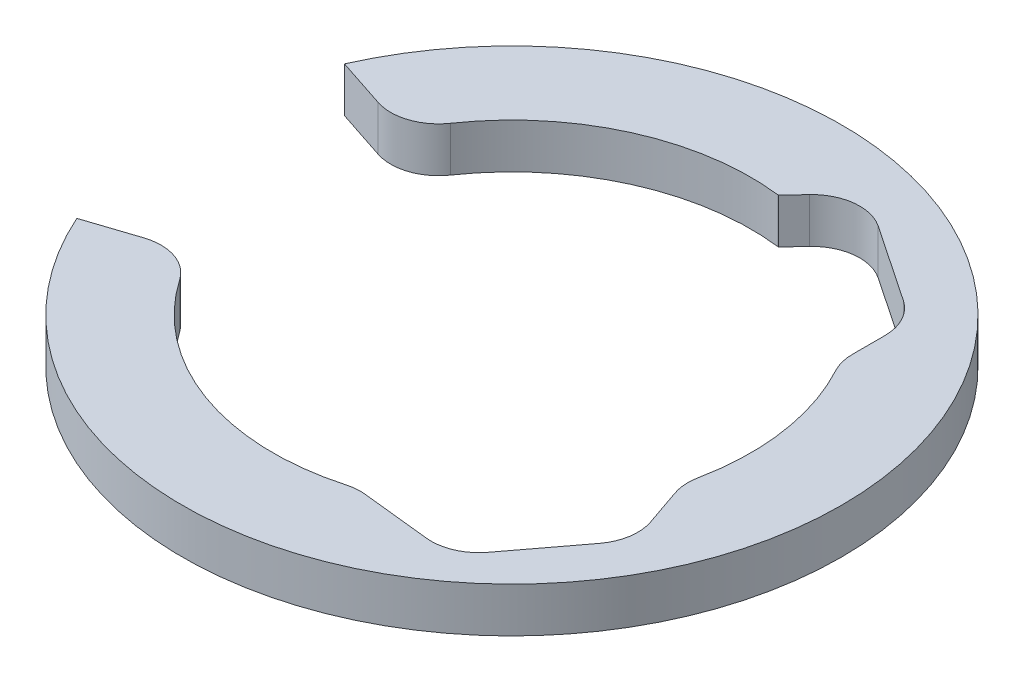
ISO-10303-21;
HEADER;
FILE_DESCRIPTION(('STEP AP214'),'2;1');
FILE_NAME('part.step','',(''),(''),'','','');
FILE_SCHEMA(('AUTOMOTIVE_DESIGN { 1 0 10303 214 1 1 1 1 }'));
ENDSEC;
DATA;
#1=APPLICATION_CONTEXT('core data for automotive mechanical design processes');
#2=APPLICATION_PROTOCOL_DEFINITION('international standard','automotive_design',2000,#1);
#3=PRODUCT_CONTEXT('',#1,'mechanical');
#4=PRODUCT('Part','Part','',(#3));
#5=PRODUCT_RELATED_PRODUCT_CATEGORY('part','',(#4));
#6=PRODUCT_DEFINITION_FORMATION('','',#4);
#7=PRODUCT_DEFINITION_CONTEXT('part definition',#1,'design');
#8=PRODUCT_DEFINITION('design','',#6,#7);
#9=PRODUCT_DEFINITION_SHAPE('','',#8);
#10=(LENGTH_UNIT() NAMED_UNIT(*) SI_UNIT(.MILLI.,.METRE.));
#11=(NAMED_UNIT(*) PLANE_ANGLE_UNIT() SI_UNIT($,.RADIAN.));
#12=(NAMED_UNIT(*) SI_UNIT($,.STERADIAN.) SOLID_ANGLE_UNIT());
#13=UNCERTAINTY_MEASURE_WITH_UNIT(LENGTH_MEASURE(1.E-05),#10,'distance_accuracy_value','');
#14=(GEOMETRIC_REPRESENTATION_CONTEXT(3) GLOBAL_UNCERTAINTY_ASSIGNED_CONTEXT((#13)) GLOBAL_UNIT_ASSIGNED_CONTEXT((#10,
#11,#12)) REPRESENTATION_CONTEXT('',''));
#15=CARTESIAN_POINT('',(0.,0.,0.));
#16=DIRECTION('',(0.,0.,1.));
#17=DIRECTION('',(1.,0.,0.));
#18=AXIS2_PLACEMENT_3D('',#15,#16,#17);
#19=CARTESIAN_POINT('',(-4.94086592085773,0.94,-3.40409223613384));
#20=DIRECTION('',(0.,-1.,0.));
#21=DIRECTION('',(0.,0.,-1.));
#22=AXIS2_PLACEMENT_3D('',#19,#20,#21);
#23=CYLINDRICAL_SURFACE('',#22,1.);
#24=CARTESIAN_POINT('',(-4.94086592085773,0.,-3.40409223613384));
#25=DIRECTION('',(0.,1.,0.));
#26=DIRECTION('',(0.,0.,1.));
#27=AXIS2_PLACEMENT_3D('',#24,#25,#26);
#28=CIRCLE('',#27,1.);
#29=CARTESIAN_POINT('',(-4.11738826738144,0.,-2.83674353011153));
#30=VERTEX_POINT('',#29);
#31=CARTESIAN_POINT('',(-5.2538636790078,0.,-2.45433837149678));
#32=VERTEX_POINT('',#31);
#33=EDGE_CURVE('E214',#30,#32,#28,.F.);
#34=ORIENTED_EDGE('',*,*,#33,.F.);
#35=DIRECTION('',(0.,-1.,0.));
#36=VECTOR('',#35,1.);
#37=CARTESIAN_POINT('',(-4.11738826738144,0.94,-2.83674353011153));
#38=LINE('',#37,#36);
#39=CARTESIAN_POINT('',(-4.11738826738144,0.94,-2.83674353011153));
#40=VERTEX_POINT('',#39);
#41=EDGE_CURVE('E11',#40,#30,#38,.T.);
#42=ORIENTED_EDGE('',*,*,#41,.F.);
#43=CARTESIAN_POINT('',(-4.94086592085773,0.94,-3.40409223613384));
#44=DIRECTION('',(0.,1.,0.));
#45=DIRECTION('',(0.,0.,1.));
#46=AXIS2_PLACEMENT_3D('',#43,#44,#45);
#47=CIRCLE('',#46,1.);
#48=CARTESIAN_POINT('',(-5.2538636790078,0.94,-2.45433837149678));
#49=VERTEX_POINT('',#48);
#50=EDGE_CURVE('E270',#40,#49,#47,.F.);
#51=ORIENTED_EDGE('',*,*,#50,.T.);
#52=DIRECTION('',(0.,-1.,0.));
#53=VECTOR('',#52,1.);
#54=CARTESIAN_POINT('',(-5.2538636790078,0.94,-2.45433837149678));
#55=LINE('',#54,#53);
#56=EDGE_CURVE('E51',#49,#32,#55,.T.);
#57=ORIENTED_EDGE('',*,*,#56,.T.);
#58=EDGE_LOOP('',(#34,#42,#51,#57));
#59=FACE_BOUND('',#58,.T.);
#60=ADVANCED_FACE('F35',(#59),#23,.T.);
#61=CARTESIAN_POINT('',(0.,0.94,0.));
#62=DIRECTION('',(0.,-1.,0.));
#63=DIRECTION('',(0.,0.,-1.));
#64=AXIS2_PLACEMENT_3D('',#61,#62,#63);
#65=CYLINDRICAL_SURFACE('',#64,5.);
#66=CARTESIAN_POINT('',(0.,0.,0.));
#67=DIRECTION('',(0.,1.,0.));
#68=DIRECTION('',(0.,0.,1.));
#69=AXIS2_PLACEMENT_3D('',#66,#67,#68);
#70=CIRCLE('',#69,5.);
#71=CARTESIAN_POINT('',(0.606687951738068,0.,-4.96305649063315));
#72=VERTEX_POINT('',#71);
#73=EDGE_CURVE('E216',#72,#30,#70,.T.);
#74=ORIENTED_EDGE('',*,*,#73,.F.);
#75=DIRECTION('',(0.,-1.,0.));
#76=VECTOR('',#75,1.);
#77=CARTESIAN_POINT('',(0.606687951738068,0.94,-4.96305649063315));
#78=LINE('',#77,#76);
#79=CARTESIAN_POINT('',(0.606687951738068,0.94,-4.96305649063315));
#80=VERTEX_POINT('',#79);
#81=EDGE_CURVE('E43',#80,#72,#78,.T.);
#82=ORIENTED_EDGE('',*,*,#81,.F.);
#83=CARTESIAN_POINT('',(0.,0.94,0.));
#84=DIRECTION('',(0.,1.,0.));
#85=DIRECTION('',(0.,0.,1.));
#86=AXIS2_PLACEMENT_3D('',#83,#84,#85);
#87=CIRCLE('',#86,5.);
#88=EDGE_CURVE('E325',#80,#40,#87,.T.);
#89=ORIENTED_EDGE('',*,*,#88,.T.);
#90=ORIENTED_EDGE('',*,*,#41,.T.);
#91=EDGE_LOOP('',(#74,#82,#89,#90));
#92=FACE_BOUND('',#91,.T.);
#93=ADVANCED_FACE('F324',(#92),#65,.F.);
#94=CARTESIAN_POINT('',(0.611804478104493,0.94,-4.96242568748557));
#95=DIRECTION('',(0.122360960660061,0.,-0.992485665038215));
#96=DIRECTION('',(-0.992485665038215,0.,-0.122360960660061));
#97=AXIS2_PLACEMENT_3D('',#94,#95,#96);
#98=PLANE('',#97);
#99=DIRECTION('',(0.992485665038215,0.,0.122360960660061));
#100=VECTOR('',#99,1.);
#101=CARTESIAN_POINT('',(0.611804478104493,0.,-4.96242568748557));
#102=LINE('',#101,#100);
#103=CARTESIAN_POINT('',(0.616921004471256,0.,-4.96179488433794));
#104=VERTEX_POINT('',#103);
#105=EDGE_CURVE('E219',#72,#104,#102,.T.);
#106=ORIENTED_EDGE('',*,*,#105,.T.);
#107=DIRECTION('',(0.,-1.,0.));
#108=VECTOR('',#107,1.);
#109=CARTESIAN_POINT('',(0.616921004471256,0.94,-4.96179488433794));
#110=LINE('',#109,#108);
#111=CARTESIAN_POINT('',(0.616921004471256,0.94,-4.96179488433794));
#112=VERTEX_POINT('',#111);
#113=EDGE_CURVE('E309',#112,#104,#110,.T.);
#114=ORIENTED_EDGE('',*,*,#113,.F.);
#115=DIRECTION('',(0.992485665038215,0.,0.122360960660061));
#116=VECTOR('',#115,1.);
#117=CARTESIAN_POINT('',(0.611804478104493,0.94,-4.96242568748557));
#118=LINE('',#117,#116);
#119=EDGE_CURVE('E316',#80,#112,#118,.T.);
#120=ORIENTED_EDGE('',*,*,#119,.F.);
#121=ORIENTED_EDGE('',*,*,#81,.T.);
#122=EDGE_LOOP('',(#106,#114,#120,#121));
#123=FACE_BOUND('',#122,.T.);
#124=ADVANCED_FACE('F314',(#123),#98,.F.);
#125=CARTESIAN_POINT('',(-2.14641419663019,0.94,-2.0080441743697));
#126=DIRECTION('',(-0.730253029028529,0.,-0.683176780631967));
#127=DIRECTION('',(-0.683176780631967,0.,0.730253029028529));
#128=AXIS2_PLACEMENT_3D('',#125,#126,#127);
#129=PLANE('',#128);
#130=DIRECTION('',(0.683176780631967,0.,-0.730253029028529));
#131=VECTOR('',#130,1.);
#132=CARTESIAN_POINT('',(-2.14641419663019,0.,-2.0080441743697));
#133=LINE('',#132,#131);
#134=CARTESIAN_POINT('',(0.93326336513957,0.,-5.29993571938561));
#135=VERTEX_POINT('',#134);
#136=EDGE_CURVE('E221',#104,#135,#133,.T.);
#137=ORIENTED_EDGE('',*,*,#136,.T.);
#138=DIRECTION('',(0.,-1.,0.));
#139=VECTOR('',#138,1.);
#140=CARTESIAN_POINT('',(0.93326336513957,0.94,-5.29993571938561));
#141=LINE('',#140,#139);
#142=CARTESIAN_POINT('',(0.93326336513957,0.94,-5.29993571938561));
#143=VERTEX_POINT('',#142);
#144=EDGE_CURVE('E307',#143,#135,#141,.T.);
#145=ORIENTED_EDGE('',*,*,#144,.F.);
#146=DIRECTION('',(0.683176780631967,0.,-0.730253029028529));
#147=VECTOR('',#146,1.);
#148=CARTESIAN_POINT('',(-2.14641419663019,0.94,-2.0080441743697));
#149=LINE('',#148,#147);
#150=EDGE_CURVE('E605',#112,#143,#149,.T.);
#151=ORIENTED_EDGE('',*,*,#150,.F.);
#152=ORIENTED_EDGE('',*,*,#113,.T.);
#153=EDGE_LOOP('',(#137,#145,#151,#152));
#154=FACE_BOUND('',#153,.T.);
#155=ADVANCED_FACE('F343',(#154),#129,.F.);
#156=CARTESIAN_POINT('',(1.6635163941681,0.94,-4.61675893875365));
#157=DIRECTION('',(0.,-1.,0.));
#158=DIRECTION('',(0.,0.,-1.));
#159=AXIS2_PLACEMENT_3D('',#156,#157,#158);
#160=CYLINDRICAL_SURFACE('',#159,1.);
#161=CARTESIAN_POINT('',(1.6635163941681,0.,-4.61675893875365));
#162=DIRECTION('',(0.,1.,0.));
#163=DIRECTION('',(0.,0.,1.));
#164=AXIS2_PLACEMENT_3D('',#161,#162,#163);
#165=CIRCLE('',#164,1.);
#166=CARTESIAN_POINT('',(2.22211677364717,0.,-5.44619586585892));
#167=VERTEX_POINT('',#166);
#168=EDGE_CURVE('E224',#167,#135,#165,.T.);
#169=ORIENTED_EDGE('',*,*,#168,.F.);
#170=DIRECTION('',(0.,-1.,0.));
#171=VECTOR('',#170,1.);
#172=CARTESIAN_POINT('',(2.22211677364717,0.94,-5.44619586585892));
#173=LINE('',#172,#171);
#174=CARTESIAN_POINT('',(2.22211677364717,0.94,-5.44619586585892));
#175=VERTEX_POINT('',#174);
#176=EDGE_CURVE('E305',#175,#167,#173,.T.);
#177=ORIENTED_EDGE('',*,*,#176,.F.);
#178=CARTESIAN_POINT('',(1.6635163941681,0.94,-4.61675893875365));
#179=DIRECTION('',(0.,1.,0.));
#180=DIRECTION('',(0.,0.,1.));
#181=AXIS2_PLACEMENT_3D('',#178,#179,#180);
#182=CIRCLE('',#181,1.);
#183=EDGE_CURVE('E602',#175,#143,#182,.T.);
#184=ORIENTED_EDGE('',*,*,#183,.T.);
#185=ORIENTED_EDGE('',*,*,#144,.T.);
#186=EDGE_LOOP('',(#169,#177,#184,#185));
#187=FACE_BOUND('',#186,.T.);
#188=ADVANCED_FACE('F348',(#187),#160,.F.);
#189=CARTESIAN_POINT('',(3.21672890590133,0.94,-4.77635504209592));
#190=DIRECTION('',(0.558600379479064,0.,-0.829436927105277));
#191=DIRECTION('',(-0.829436927105277,0.,-0.558600379479064));
#192=AXIS2_PLACEMENT_3D('',#189,#190,#191);
#193=PLANE('',#192);
#194=DIRECTION('',(0.829436927105277,0.,0.558600379479064));
#195=VECTOR('',#194,1.);
#196=CARTESIAN_POINT('',(3.21672890590133,0.,-4.77635504209592));
#197=LINE('',#196,#195);
#198=CARTESIAN_POINT('',(3.83533968853841,0.,-4.35973961705462));
#199=VERTEX_POINT('',#198);
#200=EDGE_CURVE('E227',#167,#199,#197,.T.);
#201=ORIENTED_EDGE('',*,*,#200,.T.);
#202=DIRECTION('',(0.,-1.,0.));
#203=VECTOR('',#202,1.);
#204=CARTESIAN_POINT('',(3.83533968853841,0.94,-4.35973961705462));
#205=LINE('',#204,#203);
#206=CARTESIAN_POINT('',(3.83533968853841,0.94,-4.35973961705462));
#207=VERTEX_POINT('',#206);
#208=EDGE_CURVE('E302',#207,#199,#205,.T.);
#209=ORIENTED_EDGE('',*,*,#208,.F.);
#210=DIRECTION('',(0.829436927105277,0.,0.558600379479064));
#211=VECTOR('',#210,1.);
#212=CARTESIAN_POINT('',(3.21672890590133,0.94,-4.77635504209592));
#213=LINE('',#212,#211);
#214=EDGE_CURVE('E599',#175,#207,#213,.T.);
#215=ORIENTED_EDGE('',*,*,#214,.F.);
#216=ORIENTED_EDGE('',*,*,#176,.T.);
#217=EDGE_LOOP('',(#201,#209,#215,#216));
#218=FACE_BOUND('',#217,.T.);
#219=ADVANCED_FACE('F352',(#218),#193,.F.);
#220=CARTESIAN_POINT('',(3.27673930905935,0.94,-3.53030268994934));
#221=DIRECTION('',(0.,-1.,0.));
#222=DIRECTION('',(0.,0.,-1.));
#223=AXIS2_PLACEMENT_3D('',#220,#221,#222);
#224=CYLINDRICAL_SURFACE('',#223,1.);
#225=CARTESIAN_POINT('',(3.27673930905935,0.,-3.53030268994934));
#226=DIRECTION('',(0.,1.,0.));
#227=DIRECTION('',(0.,0.,1.));
#228=AXIS2_PLACEMENT_3D('',#225,#226,#227);
#229=CIRCLE('',#228,1.);
#230=CARTESIAN_POINT('',(4.27673930905935,0.,-3.53030268994934));
#231=VERTEX_POINT('',#230);
#232=EDGE_CURVE('E229',#199,#231,#229,.F.);
#233=ORIENTED_EDGE('',*,*,#232,.T.);
#234=DIRECTION('',(0.,-1.,0.));
#235=VECTOR('',#234,1.);
#236=CARTESIAN_POINT('',(4.27673930905935,0.94,-3.53030268994934));
#237=LINE('',#236,#235);
#238=CARTESIAN_POINT('',(4.27673930905935,0.94,-3.53030268994934));
#239=VERTEX_POINT('',#238);
#240=EDGE_CURVE('E299',#239,#231,#237,.T.);
#241=ORIENTED_EDGE('',*,*,#240,.F.);
#242=CARTESIAN_POINT('',(3.27673930905935,0.94,-3.53030268994934));
#243=DIRECTION('',(0.,1.,0.));
#244=DIRECTION('',(0.,0.,1.));
#245=AXIS2_PLACEMENT_3D('',#242,#243,#244);
#246=CIRCLE('',#245,1.);
#247=EDGE_CURVE('E597',#207,#239,#246,.F.);
#248=ORIENTED_EDGE('',*,*,#247,.F.);
#249=ORIENTED_EDGE('',*,*,#208,.T.);
#250=EDGE_LOOP('',(#233,#241,#248,#249));
#251=FACE_BOUND('',#250,.T.);
#252=ADVANCED_FACE('F356',(#251),#224,.F.);
#253=CARTESIAN_POINT('',(4.27673930905935,0.94,0.));
#254=DIRECTION('',(1.,0.,0.));
#255=DIRECTION('',(0.,0.,-1.));
#256=AXIS2_PLACEMENT_3D('',#253,#254,#255);
#257=PLANE('',#256);
#258=DIRECTION('',(0.,0.,1.));
#259=VECTOR('',#258,1.);
#260=CARTESIAN_POINT('',(4.27673930905935,0.,0.));
#261=LINE('',#260,#259);
#262=CARTESIAN_POINT('',(4.27673930905935,0.,-2.85587504352482));
#263=VERTEX_POINT('',#262);
#264=EDGE_CURVE('E231',#231,#263,#261,.T.);
#265=ORIENTED_EDGE('',*,*,#264,.T.);
#266=DIRECTION('',(0.,-1.,0.));
#267=VECTOR('',#266,1.);
#268=CARTESIAN_POINT('',(4.27673930905935,0.94,-2.85587504352482));
#269=LINE('',#268,#267);
#270=CARTESIAN_POINT('',(4.27673930905935,0.94,-2.85587504352482));
#271=VERTEX_POINT('',#270);
#272=EDGE_CURVE('E297',#271,#263,#269,.T.);
#273=ORIENTED_EDGE('',*,*,#272,.F.);
#274=DIRECTION('',(0.,0.,1.));
#275=VECTOR('',#274,1.);
#276=CARTESIAN_POINT('',(4.27673930905935,0.94,0.));
#277=LINE('',#276,#275);
#278=EDGE_CURVE('E613',#239,#271,#277,.T.);
#279=ORIENTED_EDGE('',*,*,#278,.F.);
#280=ORIENTED_EDGE('',*,*,#240,.T.);
#281=EDGE_LOOP('',(#265,#273,#279,#280));
#282=FACE_BOUND('',#281,.T.);
#283=ADVANCED_FACE('F360',(#282),#257,.F.);
#284=CARTESIAN_POINT('',(5.27673930905935,0.94,-2.85587504352482));
#285=DIRECTION('',(0.,-1.,0.));
#286=DIRECTION('',(0.,0.,-1.));
#287=AXIS2_PLACEMENT_3D('',#284,#285,#286);
#288=CYLINDRICAL_SURFACE('',#287,1.);
#289=CARTESIAN_POINT('',(5.27673930905935,0.,-2.85587504352482));
#290=DIRECTION('',(0.,1.,0.));
#291=DIRECTION('',(0.,0.,1.));
#292=AXIS2_PLACEMENT_3D('',#289,#290,#291);
#293=CIRCLE('',#292,1.);
#294=CARTESIAN_POINT('',(4.39728275754945,0.,-2.37989586960402));
#295=VERTEX_POINT('',#294);
#296=EDGE_CURVE('E234',#295,#263,#293,.F.);
#297=ORIENTED_EDGE('',*,*,#296,.F.);
#298=DIRECTION('',(0.,-1.,0.));
#299=VECTOR('',#298,1.);
#300=CARTESIAN_POINT('',(4.39728275754945,0.94,-2.37989586960402));
#301=LINE('',#300,#299);
#302=CARTESIAN_POINT('',(4.39728275754945,0.94,-2.37989586960402));
#303=VERTEX_POINT('',#302);
#304=EDGE_CURVE('E295',#303,#295,#301,.T.);
#305=ORIENTED_EDGE('',*,*,#304,.F.);
#306=CARTESIAN_POINT('',(5.27673930905935,0.94,-2.85587504352482));
#307=DIRECTION('',(0.,1.,0.));
#308=DIRECTION('',(0.,0.,1.));
#309=AXIS2_PLACEMENT_3D('',#306,#307,#308);
#310=CIRCLE('',#309,1.);
#311=EDGE_CURVE('E589',#303,#271,#310,.F.);
#312=ORIENTED_EDGE('',*,*,#311,.T.);
#313=ORIENTED_EDGE('',*,*,#272,.T.);
#314=EDGE_LOOP('',(#297,#305,#312,#313));
#315=FACE_BOUND('',#314,.T.);
#316=ADVANCED_FACE('F364',(#315),#288,.T.);
#317=CARTESIAN_POINT('',(0.,0.94,0.));
#318=DIRECTION('',(0.,-1.,0.));
#319=DIRECTION('',(0.,0.,-1.));
#320=AXIS2_PLACEMENT_3D('',#317,#318,#319);
#321=CYLINDRICAL_SURFACE('',#320,5.);
#322=CARTESIAN_POINT('',(0.,0.,0.));
#323=DIRECTION('',(0.,1.,0.));
#324=DIRECTION('',(0.,0.,1.));
#325=AXIS2_PLACEMENT_3D('',#322,#323,#324);
#326=CIRCLE('',#325,5.);
#327=CARTESIAN_POINT('',(4.90006825482678,0.,0.994651244426331));
#328=VERTEX_POINT('',#327);
#329=EDGE_CURVE('E237',#328,#295,#326,.T.);
#330=ORIENTED_EDGE('',*,*,#329,.F.);
#331=DIRECTION('',(0.,-1.,0.));
#332=VECTOR('',#331,1.);
#333=CARTESIAN_POINT('',(4.90006825482678,0.94,0.994651244426331));
#334=LINE('',#333,#332);
#335=CARTESIAN_POINT('',(4.90006825482678,0.94,0.994651244426331));
#336=VERTEX_POINT('',#335);
#337=EDGE_CURVE('E293',#336,#328,#334,.T.);
#338=ORIENTED_EDGE('',*,*,#337,.F.);
#339=CARTESIAN_POINT('',(0.,0.94,0.));
#340=DIRECTION('',(0.,1.,0.));
#341=DIRECTION('',(0.,0.,1.));
#342=AXIS2_PLACEMENT_3D('',#339,#340,#341);
#343=CIRCLE('',#342,5.);
#344=EDGE_CURVE('E585',#336,#303,#343,.T.);
#345=ORIENTED_EDGE('',*,*,#344,.T.);
#346=ORIENTED_EDGE('',*,*,#304,.T.);
#347=EDGE_LOOP('',(#330,#338,#345,#346));
#348=FACE_BOUND('',#347,.T.);
#349=ADVANCED_FACE('F368',(#348),#321,.F.);
#350=CARTESIAN_POINT('',(5.88008190579213,0.94,1.1935814933116));
#351=DIRECTION('',(0.,-1.,0.));
#352=DIRECTION('',(0.,0.,-1.));
#353=AXIS2_PLACEMENT_3D('',#350,#351,#352);
#354=CYLINDRICAL_SURFACE('',#353,0.999999999999999);
#355=CARTESIAN_POINT('',(5.88008190579213,0.,1.1935814933116));
#356=DIRECTION('',(0.,1.,0.));
#357=DIRECTION('',(0.,0.,1.));
#358=AXIS2_PLACEMENT_3D('',#355,#356,#357);
#359=CIRCLE('',#358,0.999999999999999);
#360=CARTESIAN_POINT('',(4.93449413525411,0.,1.51894862165885));
#361=VERTEX_POINT('',#360);
#362=EDGE_CURVE('E240',#361,#328,#359,.F.);
#363=ORIENTED_EDGE('',*,*,#362,.F.);
#364=DIRECTION('',(0.,-1.,0.));
#365=VECTOR('',#364,1.);
#366=CARTESIAN_POINT('',(4.93449413525411,0.94,1.51894862165885));
#367=LINE('',#366,#365);
#368=CARTESIAN_POINT('',(4.93449413525411,0.94,1.51894862165885));
#369=VERTEX_POINT('',#368);
#370=EDGE_CURVE('E291',#369,#361,#367,.T.);
#371=ORIENTED_EDGE('',*,*,#370,.F.);
#372=CARTESIAN_POINT('',(5.88008190579213,0.94,1.1935814933116));
#373=DIRECTION('',(0.,1.,0.));
#374=DIRECTION('',(0.,0.,1.));
#375=AXIS2_PLACEMENT_3D('',#372,#373,#374);
#376=CIRCLE('',#375,0.999999999999999);
#377=EDGE_CURVE('E579',#369,#336,#376,.F.);
#378=ORIENTED_EDGE('',*,*,#377,.T.);
#379=ORIENTED_EDGE('',*,*,#337,.T.);
#380=EDGE_LOOP('',(#363,#371,#378,#379));
#381=FACE_BOUND('',#380,.T.);
#382=ADVANCED_FACE('F372',(#381),#354,.T.);
#383=CARTESIAN_POINT('',(3.94478543249207,0.94,-1.35736052020397));
#384=DIRECTION('',(0.945587770538021,0.,-0.325367128347248));
#385=DIRECTION('',(-0.325367128347248,0.,-0.945587770538021));
#386=AXIS2_PLACEMENT_3D('',#383,#384,#385);
#387=PLANE('',#386);
#388=DIRECTION('',(0.325367128347248,0.,0.945587770538021));
#389=VECTOR('',#388,1.);
#390=CARTESIAN_POINT('',(3.94478543249207,0.,-1.35736052020397));
#391=LINE('',#390,#389);
#392=CARTESIAN_POINT('',(5.20236441680341,0.,2.29743802718128));
#393=VERTEX_POINT('',#392);
#394=EDGE_CURVE('E243',#361,#393,#391,.T.);
#395=ORIENTED_EDGE('',*,*,#394,.T.);
#396=DIRECTION('',(0.,-1.,0.));
#397=VECTOR('',#396,1.);
#398=CARTESIAN_POINT('',(5.20236441680341,0.94,2.29743802718128));
#399=LINE('',#398,#397);
#400=CARTESIAN_POINT('',(5.20236441680341,0.94,2.29743802718128));
#401=VERTEX_POINT('',#400);
#402=EDGE_CURVE('E288',#401,#393,#399,.T.);
#403=ORIENTED_EDGE('',*,*,#402,.F.);
#404=DIRECTION('',(0.325367128347248,0.,0.945587770538021));
#405=VECTOR('',#404,1.);
#406=CARTESIAN_POINT('',(3.94478543249207,0.94,-1.35736052020397));
#407=LINE('',#406,#405);
#408=EDGE_CURVE('E576',#369,#401,#407,.T.);
#409=ORIENTED_EDGE('',*,*,#408,.F.);
#410=ORIENTED_EDGE('',*,*,#370,.T.);
#411=EDGE_LOOP('',(#395,#403,#409,#410));
#412=FACE_BOUND('',#411,.T.);
#413=ADVANCED_FACE('F376',(#412),#387,.F.);
#414=CARTESIAN_POINT('',(4.25677664626539,0.94,2.62280515552853));
#415=DIRECTION('',(0.,-1.,0.));
#416=DIRECTION('',(0.,0.,-1.));
#417=AXIS2_PLACEMENT_3D('',#414,#415,#416);
#418=CYLINDRICAL_SURFACE('',#417,1.);
#419=CARTESIAN_POINT('',(4.25677664626539,0.,2.62280515552853));
#420=DIRECTION('',(0.,1.,0.));
#421=DIRECTION('',(0.,0.,1.));
#422=AXIS2_PLACEMENT_3D('',#419,#420,#421);
#423=CIRCLE('',#422,1.);
#424=CARTESIAN_POINT('',(5.05446685520372,0.,3.22587259003641));
#425=VERTEX_POINT('',#424);
#426=EDGE_CURVE('E245',#393,#425,#423,.F.);
#427=ORIENTED_EDGE('',*,*,#426,.T.);
#428=DIRECTION('',(0.,-1.,0.));
#429=VECTOR('',#428,1.);
#430=CARTESIAN_POINT('',(5.05446685520372,0.94,3.22587259003641));
#431=LINE('',#430,#429);
#432=CARTESIAN_POINT('',(5.05446685520372,0.94,3.22587259003641));
#433=VERTEX_POINT('',#432);
#434=EDGE_CURVE('E285',#433,#425,#431,.T.);
#435=ORIENTED_EDGE('',*,*,#434,.F.);
#436=CARTESIAN_POINT('',(4.25677664626539,0.94,2.62280515552853));
#437=DIRECTION('',(0.,1.,0.));
#438=DIRECTION('',(0.,0.,1.));
#439=AXIS2_PLACEMENT_3D('',#436,#437,#438);
#440=CIRCLE('',#439,1.);
#441=EDGE_CURVE('E574',#401,#433,#440,.F.);
#442=ORIENTED_EDGE('',*,*,#441,.F.);
#443=ORIENTED_EDGE('',*,*,#402,.T.);
#444=EDGE_LOOP('',(#427,#435,#442,#443));
#445=FACE_BOUND('',#444,.T.);
#446=ADVANCED_FACE('F380',(#445),#418,.F.);
#447=CARTESIAN_POINT('',(4.76804758860792,0.94,3.60472548697854));
#448=DIRECTION('',(0.797690208938336,0.,0.603067434507878));
#449=DIRECTION('',(0.603067434507878,0.,-0.797690208938336));
#450=AXIS2_PLACEMENT_3D('',#447,#448,#449);
#451=PLANE('',#450);
#452=DIRECTION('',(-0.603067434507878,0.,0.797690208938336));
#453=VECTOR('',#452,1.);
#454=CARTESIAN_POINT('',(4.76804758860792,0.,3.60472548697854));
#455=LINE('',#454,#453);
#456=CARTESIAN_POINT('',(4.05451714677794,0.,4.54852748101539));
#457=VERTEX_POINT('',#456);
#458=EDGE_CURVE('E247',#425,#457,#455,.T.);
#459=ORIENTED_EDGE('',*,*,#458,.T.);
#460=DIRECTION('',(0.,-1.,0.));
#461=VECTOR('',#460,1.);
#462=CARTESIAN_POINT('',(4.05451714677794,0.94,4.54852748101539));
#463=LINE('',#462,#461);
#464=CARTESIAN_POINT('',(4.05451714677794,0.94,4.54852748101539));
#465=VERTEX_POINT('',#464);
#466=EDGE_CURVE('E283',#465,#457,#463,.T.);
#467=ORIENTED_EDGE('',*,*,#466,.F.);
#468=DIRECTION('',(-0.603067434507878,0.,0.797690208938336));
#469=VECTOR('',#468,1.);
#470=CARTESIAN_POINT('',(4.76804758860792,0.94,3.60472548697854));
#471=LINE('',#470,#469);
#472=EDGE_CURVE('E620',#433,#465,#471,.T.);
#473=ORIENTED_EDGE('',*,*,#472,.F.);
#474=ORIENTED_EDGE('',*,*,#434,.T.);
#475=EDGE_LOOP('',(#459,#467,#473,#474));
#476=FACE_BOUND('',#475,.T.);
#477=ADVANCED_FACE('F384',(#476),#451,.F.);
#478=CARTESIAN_POINT('',(3.2568269378396,0.94,3.94546004650751));
#479=DIRECTION('',(0.,-1.,0.));
#480=DIRECTION('',(0.,0.,-1.));
#481=AXIS2_PLACEMENT_3D('',#478,#479,#480);
#482=CYLINDRICAL_SURFACE('',#481,1.);
#483=CARTESIAN_POINT('',(3.2568269378396,0.,3.94546004650751));
#484=DIRECTION('',(0.,1.,0.));
#485=DIRECTION('',(0.,0.,1.));
#486=AXIS2_PLACEMENT_3D('',#483,#484,#485);
#487=CIRCLE('',#486,1.);
#488=CARTESIAN_POINT('',(3.15043384106828,0.,4.93978419333259));
#489=VERTEX_POINT('',#488);
#490=EDGE_CURVE('E250',#489,#457,#487,.T.);
#491=ORIENTED_EDGE('',*,*,#490,.F.);
#492=DIRECTION('',(0.,-1.,0.));
#493=VECTOR('',#492,1.);
#494=CARTESIAN_POINT('',(3.15043384106828,0.94,4.93978419333259));
#495=LINE('',#494,#493);
#496=CARTESIAN_POINT('',(3.15043384106828,0.94,4.93978419333259));
#497=VERTEX_POINT('',#496);
#498=EDGE_CURVE('E281',#497,#489,#495,.T.);
#499=ORIENTED_EDGE('',*,*,#498,.F.);
#500=CARTESIAN_POINT('',(3.2568269378396,0.94,3.94546004650751));
#501=DIRECTION('',(0.,1.,0.));
#502=DIRECTION('',(0.,0.,1.));
#503=AXIS2_PLACEMENT_3D('',#500,#501,#502);
#504=CIRCLE('',#503,1.);
#505=EDGE_CURVE('E566',#497,#465,#504,.T.);
#506=ORIENTED_EDGE('',*,*,#505,.T.);
#507=ORIENTED_EDGE('',*,*,#466,.T.);
#508=EDGE_LOOP('',(#491,#499,#506,#507));
#509=FACE_BOUND('',#508,.T.);
#510=ADVANCED_FACE('F388',(#509),#482,.F.);
#511=CARTESIAN_POINT('',(-0.486914634707484,0.94,4.55058639540132));
#512=DIRECTION('',(-0.106393096771315,0.,0.994324146825073));
#513=DIRECTION('',(0.994324146825073,0.,0.106393096771315));
#514=AXIS2_PLACEMENT_3D('',#511,#512,#513);
#515=PLANE('',#514);
#516=DIRECTION('',(-0.994324146825073,0.,-0.106393096771315));
#517=VECTOR('',#516,1.);
#518=CARTESIAN_POINT('',(-0.486914634707484,0.,4.55058639540132));
#519=LINE('',#518,#517);
#520=CARTESIAN_POINT('',(1.71455428427488,0.,4.7861444842642));
#521=VERTEX_POINT('',#520);
#522=EDGE_CURVE('E253',#489,#521,#519,.T.);
#523=ORIENTED_EDGE('',*,*,#522,.T.);
#524=DIRECTION('',(0.,-1.,0.));
#525=VECTOR('',#524,1.);
#526=CARTESIAN_POINT('',(1.71455428427488,0.94,4.7861444842642));
#527=LINE('',#526,#525);
#528=CARTESIAN_POINT('',(1.71455428427488,0.94,4.7861444842642));
#529=VERTEX_POINT('',#528);
#530=EDGE_CURVE('E278',#529,#521,#527,.T.);
#531=ORIENTED_EDGE('',*,*,#530,.F.);
#532=DIRECTION('',(-0.994324146825073,0.,-0.106393096771315));
#533=VECTOR('',#532,1.);
#534=CARTESIAN_POINT('',(-0.486914634707484,0.94,4.55058639540132));
#535=LINE('',#534,#533);
#536=EDGE_CURVE('E623',#497,#529,#535,.T.);
#537=ORIENTED_EDGE('',*,*,#536,.F.);
#538=ORIENTED_EDGE('',*,*,#498,.T.);
#539=EDGE_LOOP('',(#523,#531,#537,#538));
#540=FACE_BOUND('',#539,.T.);
#541=ADVANCED_FACE('F392',(#540),#515,.F.);
#542=CARTESIAN_POINT('',(1.60816118750356,0.94,5.78046863108928));
#543=DIRECTION('',(0.,-1.,0.));
#544=DIRECTION('',(0.,0.,-1.));
#545=AXIS2_PLACEMENT_3D('',#542,#543,#544);
#546=CYLINDRICAL_SURFACE('',#545,1.);
#547=CARTESIAN_POINT('',(1.60816118750356,0.,5.78046863108928));
#548=DIRECTION('',(0.,1.,0.));
#549=DIRECTION('',(0.,0.,1.));
#550=AXIS2_PLACEMENT_3D('',#547,#548,#549);
#551=CIRCLE('',#550,1.);
#552=CARTESIAN_POINT('',(1.34013432291964,0.,4.8170571925744));
#553=VERTEX_POINT('',#552);
#554=EDGE_CURVE('E255',#521,#553,#551,.T.);
#555=ORIENTED_EDGE('',*,*,#554,.T.);
#556=DIRECTION('',(0.,-1.,0.));
#557=VECTOR('',#556,1.);
#558=CARTESIAN_POINT('',(1.34013432291964,0.94,4.8170571925744));
#559=LINE('',#558,#557);
#560=CARTESIAN_POINT('',(1.34013432291964,0.94,4.8170571925744));
#561=VERTEX_POINT('',#560);
#562=EDGE_CURVE('E276',#561,#553,#559,.T.);
#563=ORIENTED_EDGE('',*,*,#562,.F.);
#564=CARTESIAN_POINT('',(1.60816118750356,0.94,5.78046863108928));
#565=DIRECTION('',(0.,1.,0.));
#566=DIRECTION('',(0.,0.,1.));
#567=AXIS2_PLACEMENT_3D('',#564,#565,#566);
#568=CIRCLE('',#567,1.);
#569=EDGE_CURVE('E625',#529,#561,#568,.T.);
#570=ORIENTED_EDGE('',*,*,#569,.F.);
#571=ORIENTED_EDGE('',*,*,#530,.T.);
#572=EDGE_LOOP('',(#555,#563,#570,#571));
#573=FACE_BOUND('',#572,.T.);
#574=ADVANCED_FACE('F396',(#573),#546,.T.);
#575=CARTESIAN_POINT('',(0.,0.94,0.));
#576=DIRECTION('',(0.,-1.,0.));
#577=DIRECTION('',(0.,0.,-1.));
#578=AXIS2_PLACEMENT_3D('',#575,#576,#577);
#579=CYLINDRICAL_SURFACE('',#578,5.);
#580=CARTESIAN_POINT('',(0.,0.,0.));
#581=DIRECTION('',(0.,1.,0.));
#582=DIRECTION('',(0.,0.,1.));
#583=AXIS2_PLACEMENT_3D('',#580,#581,#582);
#584=CIRCLE('',#583,5.);
#585=CARTESIAN_POINT('',(-4.11738826738144,0.,2.83674353011153));
#586=VERTEX_POINT('',#585);
#587=EDGE_CURVE('E258',#586,#553,#584,.T.);
#588=ORIENTED_EDGE('',*,*,#587,.F.);
#589=DIRECTION('',(0.,-1.,0.));
#590=VECTOR('',#589,1.);
#591=CARTESIAN_POINT('',(-4.11738826738144,0.94,2.83674353011153));
#592=LINE('',#591,#590);
#593=CARTESIAN_POINT('',(-4.11738826738144,0.94,2.83674353011153));
#594=VERTEX_POINT('',#593);
#595=EDGE_CURVE('E274',#594,#586,#592,.T.);
#596=ORIENTED_EDGE('',*,*,#595,.F.);
#597=CARTESIAN_POINT('',(0.,0.94,0.));
#598=DIRECTION('',(0.,1.,0.));
#599=DIRECTION('',(0.,0.,1.));
#600=AXIS2_PLACEMENT_3D('',#597,#598,#599);
#601=CIRCLE('',#600,5.);
#602=EDGE_CURVE('E209',#594,#561,#601,.T.);
#603=ORIENTED_EDGE('',*,*,#602,.T.);
#604=ORIENTED_EDGE('',*,*,#562,.T.);
#605=EDGE_LOOP('',(#588,#596,#603,#604));
#606=FACE_BOUND('',#605,.T.);
#607=ADVANCED_FACE('F400',(#606),#579,.F.);
#608=CARTESIAN_POINT('',(-4.94086592085773,0.94,3.40409223613384));
#609=DIRECTION('',(0.,-1.,0.));
#610=DIRECTION('',(0.,0.,-1.));
#611=AXIS2_PLACEMENT_3D('',#608,#609,#610);
#612=CYLINDRICAL_SURFACE('',#611,1.);
#613=CARTESIAN_POINT('',(-4.94086592085773,0.,3.40409223613384));
#614=DIRECTION('',(0.,1.,0.));
#615=DIRECTION('',(0.,0.,1.));
#616=AXIS2_PLACEMENT_3D('',#613,#614,#615);
#617=CIRCLE('',#616,1.);
#618=CARTESIAN_POINT('',(-5.2538636790078,0.,2.45433837149678));
#619=VERTEX_POINT('',#618);
#620=EDGE_CURVE('E261',#586,#619,#617,.T.);
#621=ORIENTED_EDGE('',*,*,#620,.T.);
#622=DIRECTION('',(0.,-1.,0.));
#623=VECTOR('',#622,1.);
#624=CARTESIAN_POINT('',(-5.2538636790078,0.94,2.45433837149678));
#625=LINE('',#624,#623);
#626=CARTESIAN_POINT('',(-5.2538636790078,0.94,2.45433837149678));
#627=VERTEX_POINT('',#626);
#628=EDGE_CURVE('E195',#627,#619,#625,.T.);
#629=ORIENTED_EDGE('',*,*,#628,.F.);
#630=CARTESIAN_POINT('',(-4.94086592085773,0.94,3.40409223613384));
#631=DIRECTION('',(0.,1.,0.));
#632=DIRECTION('',(0.,0.,1.));
#633=AXIS2_PLACEMENT_3D('',#630,#631,#632);
#634=CIRCLE('',#633,1.);
#635=EDGE_CURVE('E206',#594,#627,#634,.T.);
#636=ORIENTED_EDGE('',*,*,#635,.F.);
#637=ORIENTED_EDGE('',*,*,#595,.T.);
#638=EDGE_LOOP('',(#621,#629,#636,#637));
#639=FACE_BOUND('',#638,.T.);
#640=ADVANCED_FACE('F404',(#639),#612,.T.);
#641=CARTESIAN_POINT('',(0.214894808307622,0.94,0.652072321178571));
#642=DIRECTION('',(-0.312997758150069,0.,-0.94975386463706));
#643=DIRECTION('',(-0.94975386463706,0.,0.312997758150069));
#644=AXIS2_PLACEMENT_3D('',#641,#642,#643);
#645=PLANE('',#644);
#646=DIRECTION('',(0.94975386463706,0.,-0.312997758150069));
#647=VECTOR('',#646,1.);
#648=CARTESIAN_POINT('',(0.214894808307622,0.,0.652072321178571));
#649=LINE('',#648,#647);
#650=CARTESIAN_POINT('',(-6.30588462466625,0.,2.80103893232455));
#651=VERTEX_POINT('',#650);
#652=EDGE_CURVE('E192',#651,#619,#649,.T.);
#653=ORIENTED_EDGE('',*,*,#652,.F.);
#654=DIRECTION('',(0.,-1.,0.));
#655=VECTOR('',#654,1.);
#656=CARTESIAN_POINT('',(-6.30588462466625,0.94,2.80103893232455));
#657=LINE('',#656,#655);
#658=CARTESIAN_POINT('',(-6.30588462466625,0.94,2.80103893232455));
#659=VERTEX_POINT('',#658);
#660=EDGE_CURVE('E186',#659,#651,#657,.T.);
#661=ORIENTED_EDGE('',*,*,#660,.F.);
#662=DIRECTION('',(0.94975386463706,0.,-0.312997758150069));
#663=VECTOR('',#662,1.);
#664=CARTESIAN_POINT('',(0.214894808307622,0.94,0.652072321178571));
#665=LINE('',#664,#663);
#666=EDGE_CURVE('E190',#659,#627,#665,.T.);
#667=ORIENTED_EDGE('',*,*,#666,.T.);
#668=ORIENTED_EDGE('',*,*,#628,.T.);
#669=EDGE_LOOP('',(#653,#661,#667,#668));
#670=FACE_BOUND('',#669,.T.);
#671=ADVANCED_FACE('F188',(#670),#645,.T.);
#672=CARTESIAN_POINT('',(0.,0.94,0.));
#673=DIRECTION('',(0.,-1.,0.));
#674=DIRECTION('',(0.,0.,-1.));
#675=AXIS2_PLACEMENT_3D('',#672,#673,#674);
#676=CYLINDRICAL_SURFACE('',#675,6.9);
#677=CARTESIAN_POINT('',(0.,0.,0.));
#678=DIRECTION('',(0.,1.,0.));
#679=DIRECTION('',(0.,0.,1.));
#680=AXIS2_PLACEMENT_3D('',#677,#678,#679);
#681=CIRCLE('',#680,6.9);
#682=CARTESIAN_POINT('',(-6.30588462466625,0.,-2.80103893232454));
#683=VERTEX_POINT('',#682);
#684=EDGE_CURVE('E265',#651,#683,#681,.T.);
#685=ORIENTED_EDGE('',*,*,#684,.T.);
#686=DIRECTION('',(0.,-1.,0.));
#687=VECTOR('',#686,1.);
#688=CARTESIAN_POINT('',(-6.30588462466625,0.94,-2.80103893232454));
#689=LINE('',#688,#687);
#690=CARTESIAN_POINT('',(-6.30588462466625,0.94,-2.80103893232454));
#691=VERTEX_POINT('',#690);
#692=EDGE_CURVE('E119',#691,#683,#689,.T.);
#693=ORIENTED_EDGE('',*,*,#692,.F.);
#694=CARTESIAN_POINT('',(0.,0.94,0.));
#695=DIRECTION('',(0.,1.,0.));
#696=DIRECTION('',(0.,0.,1.));
#697=AXIS2_PLACEMENT_3D('',#694,#695,#696);
#698=CIRCLE('',#697,6.9);
#699=EDGE_CURVE('E197',#659,#691,#698,.T.);
#700=ORIENTED_EDGE('',*,*,#699,.F.);
#701=ORIENTED_EDGE('',*,*,#660,.T.);
#702=EDGE_LOOP('',(#685,#693,#700,#701));
#703=FACE_BOUND('',#702,.T.);
#704=ADVANCED_FACE('F198',(#703),#676,.T.);
#705=CARTESIAN_POINT('',(0.214894808307625,0.94,-0.652072321178588));
#706=DIRECTION('',(-0.312997758150066,0.,0.949753864637061));
#707=DIRECTION('',(0.949753864637061,0.,0.312997758150066));
#708=AXIS2_PLACEMENT_3D('',#705,#706,#707);
#709=PLANE('',#708);
#710=DIRECTION('',(-0.949753864637061,0.,-0.312997758150066));
#711=VECTOR('',#710,1.);
#712=CARTESIAN_POINT('',(0.214894808307625,0.,-0.652072321178588));
#713=LINE('',#712,#711);
#714=EDGE_CURVE('E267',#32,#683,#713,.T.);
#715=ORIENTED_EDGE('',*,*,#714,.F.);
#716=ORIENTED_EDGE('',*,*,#56,.F.);
#717=DIRECTION('',(-0.949753864637061,0.,-0.312997758150066));
#718=VECTOR('',#717,1.);
#719=CARTESIAN_POINT('',(0.214894808307625,0.94,-0.652072321178588));
#720=LINE('',#719,#718);
#721=EDGE_CURVE('E201',#49,#691,#720,.T.);
#722=ORIENTED_EDGE('',*,*,#721,.T.);
#723=ORIENTED_EDGE('',*,*,#692,.T.);
#724=EDGE_LOOP('',(#715,#716,#722,#723));
#725=FACE_BOUND('',#724,.T.);
#726=ADVANCED_FACE('F326',(#725),#709,.T.);
#727=CARTESIAN_POINT('',(0.,0.94,0.));
#728=DIRECTION('',(0.,1.,0.));
#729=DIRECTION('',(0.,0.,1.));
#730=AXIS2_PLACEMENT_3D('',#727,#728,#729);
#731=PLANE('',#730);
#732=ORIENTED_EDGE('',*,*,#50,.F.);
#733=ORIENTED_EDGE('',*,*,#88,.F.);
#734=ORIENTED_EDGE('',*,*,#119,.T.);
#735=ORIENTED_EDGE('',*,*,#150,.T.);
#736=ORIENTED_EDGE('',*,*,#183,.F.);
#737=ORIENTED_EDGE('',*,*,#214,.T.);
#738=ORIENTED_EDGE('',*,*,#247,.T.);
#739=ORIENTED_EDGE('',*,*,#278,.T.);
#740=ORIENTED_EDGE('',*,*,#311,.F.);
#741=ORIENTED_EDGE('',*,*,#344,.F.);
#742=ORIENTED_EDGE('',*,*,#377,.F.);
#743=ORIENTED_EDGE('',*,*,#408,.T.);
#744=ORIENTED_EDGE('',*,*,#441,.T.);
#745=ORIENTED_EDGE('',*,*,#472,.T.);
#746=ORIENTED_EDGE('',*,*,#505,.F.);
#747=ORIENTED_EDGE('',*,*,#536,.T.);
#748=ORIENTED_EDGE('',*,*,#569,.T.);
#749=ORIENTED_EDGE('',*,*,#602,.F.);
#750=ORIENTED_EDGE('',*,*,#635,.T.);
#751=ORIENTED_EDGE('',*,*,#666,.F.);
#752=ORIENTED_EDGE('',*,*,#699,.T.);
#753=ORIENTED_EDGE('',*,*,#721,.F.);
#754=EDGE_LOOP('',(#732,#733,#734,#735,#736,#737,#738,#739,#740,#741,#742,#743,#744,#745,#746,
#747,#748,#749,#750,#751,#752,#753));
#755=FACE_BOUND('',#754,.T.);
#756=ADVANCED_FACE('F203',(#755),#731,.T.);
#757=CARTESIAN_POINT('',(0.,0.,0.));
#758=DIRECTION('',(0.,1.,0.));
#759=DIRECTION('',(0.,0.,1.));
#760=AXIS2_PLACEMENT_3D('',#757,#758,#759);
#761=PLANE('',#760);
#762=ORIENTED_EDGE('',*,*,#33,.T.);
#763=ORIENTED_EDGE('',*,*,#714,.T.);
#764=ORIENTED_EDGE('',*,*,#684,.F.);
#765=ORIENTED_EDGE('',*,*,#652,.T.);
#766=ORIENTED_EDGE('',*,*,#620,.F.);
#767=ORIENTED_EDGE('',*,*,#587,.T.);
#768=ORIENTED_EDGE('',*,*,#554,.F.);
#769=ORIENTED_EDGE('',*,*,#522,.F.);
#770=ORIENTED_EDGE('',*,*,#490,.T.);
#771=ORIENTED_EDGE('',*,*,#458,.F.);
#772=ORIENTED_EDGE('',*,*,#426,.F.);
#773=ORIENTED_EDGE('',*,*,#394,.F.);
#774=ORIENTED_EDGE('',*,*,#362,.T.);
#775=ORIENTED_EDGE('',*,*,#329,.T.);
#776=ORIENTED_EDGE('',*,*,#296,.T.);
#777=ORIENTED_EDGE('',*,*,#264,.F.);
#778=ORIENTED_EDGE('',*,*,#232,.F.);
#779=ORIENTED_EDGE('',*,*,#200,.F.);
#780=ORIENTED_EDGE('',*,*,#168,.T.);
#781=ORIENTED_EDGE('',*,*,#136,.F.);
#782=ORIENTED_EDGE('',*,*,#105,.F.);
#783=ORIENTED_EDGE('',*,*,#73,.T.);
#784=EDGE_LOOP('',(#762,#763,#764,#765,#766,#767,#768,#769,#770,#771,#772,#773,#774,#775,#776,
#777,#778,#779,#780,#781,#782,#783));
#785=FACE_BOUND('',#784,.T.);
#786=ADVANCED_FACE('F323',(#785),#761,.F.);
#787=CLOSED_SHELL('',(#60,#93,#124,#155,#188,#219,#252,#283,#316,#349,#382,#413,#446,#477,#510,
#541,#574,#607,#640,#671,#704,#726,#756,#786));
#788=MANIFOLD_SOLID_BREP('B2',#787);
#789=ADVANCED_BREP_SHAPE_REPRESENTATION('',(#18,#788),#14);
#790=SHAPE_DEFINITION_REPRESENTATION(#9,#789);
ENDSEC;
END-ISO-10303-21;
